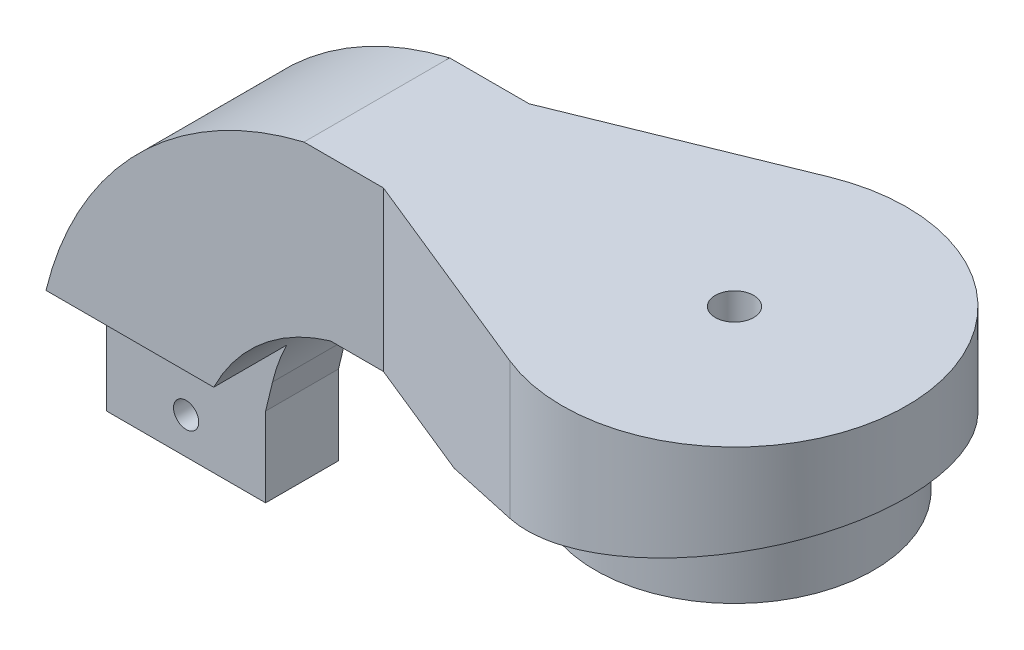
ISO-10303-21;
HEADER;
FILE_DESCRIPTION(('STEP AP214'),'2;1');
FILE_NAME('part.step','',(''),(''),'','','');
FILE_SCHEMA(('AUTOMOTIVE_DESIGN { 1 0 10303 214 1 1 1 1 }'));
ENDSEC;
DATA;
#1=APPLICATION_CONTEXT('core data for automotive mechanical design processes');
#2=APPLICATION_PROTOCOL_DEFINITION('international standard','automotive_design',2000,#1);
#3=PRODUCT_CONTEXT('',#1,'mechanical');
#4=PRODUCT('Part','Part','',(#3));
#5=PRODUCT_RELATED_PRODUCT_CATEGORY('part','',(#4));
#6=PRODUCT_DEFINITION_FORMATION('','',#4);
#7=PRODUCT_DEFINITION_CONTEXT('part definition',#1,'design');
#8=PRODUCT_DEFINITION('design','',#6,#7);
#9=PRODUCT_DEFINITION_SHAPE('','',#8);
#10=(LENGTH_UNIT() NAMED_UNIT(*) SI_UNIT(.MILLI.,.METRE.));
#11=(NAMED_UNIT(*) PLANE_ANGLE_UNIT() SI_UNIT($,.RADIAN.));
#12=(NAMED_UNIT(*) SI_UNIT($,.STERADIAN.) SOLID_ANGLE_UNIT());
#13=UNCERTAINTY_MEASURE_WITH_UNIT(LENGTH_MEASURE(1.E-05),#10,'distance_accuracy_value','');
#14=(GEOMETRIC_REPRESENTATION_CONTEXT(3) GLOBAL_UNCERTAINTY_ASSIGNED_CONTEXT((#13)) GLOBAL_UNIT_ASSIGNED_CONTEXT((#10,
#11,#12)) REPRESENTATION_CONTEXT('',''));
#15=CARTESIAN_POINT('',(0.,0.,0.));
#16=DIRECTION('',(0.,0.,1.));
#17=DIRECTION('',(1.,0.,0.));
#18=AXIS2_PLACEMENT_3D('',#15,#16,#17);
#19=CARTESIAN_POINT('',(-42.,24.,11.));
#20=DIRECTION('',(0.376404535641537,0.,-0.926455409368675));
#21=DIRECTION('',(0.,-1.,0.));
#22=AXIS2_PLACEMENT_3D('',#19,#20,#21);
#23=PLANE('',#22);
#24=DIRECTION('',(0.926455409368675,0.,0.376404535641537));
#25=VECTOR('',#24,1.);
#26=CARTESIAN_POINT('',(-42.,0.,11.));
#27=LINE('',#26,#25);
#28=CARTESIAN_POINT('',(-42.,0.,11.));
#29=VERTEX_POINT('',#28);
#30=CARTESIAN_POINT('',(-24.,0.,18.3131222215699));
#31=VERTEX_POINT('',#30);
#32=EDGE_CURVE('E441',#29,#31,#27,.T.);
#33=ORIENTED_EDGE('',*,*,#32,.T.);
#34=DIRECTION('',(0.904369439054215,0.217048665373012,0.367431346736448));
#35=VECTOR('',#34,1.);
#36=CARTESIAN_POINT('',(-36.4410054694557,-2.98584131266939,13.258533690606));
#37=LINE('',#36,#35);
#38=CARTESIAN_POINT('',(-9.78651792667998,3.41123569759681,24.0878406435855));
#39=VERTEX_POINT('',#38);
#40=EDGE_CURVE('E325',#31,#39,#37,.T.);
#41=ORIENTED_EDGE('',*,*,#40,.T.);
#42=DIRECTION('',(0.,-1.,0.));
#43=VECTOR('',#42,1.);
#44=CARTESIAN_POINT('',(-9.78651792667998,24.,24.0878406435855));
#45=LINE('',#44,#43);
#46=CARTESIAN_POINT('',(-9.78651792667998,24.,24.0878406435855));
#47=VERTEX_POINT('',#46);
#48=EDGE_CURVE('E54',#47,#39,#45,.T.);
#49=ORIENTED_EDGE('',*,*,#48,.F.);
#50=DIRECTION('',(0.926455409368675,0.,0.376404535641537));
#51=VECTOR('',#50,1.);
#52=CARTESIAN_POINT('',(-42.,24.,11.));
#53=LINE('',#52,#51);
#54=CARTESIAN_POINT('',(-42.,24.,11.));
#55=VERTEX_POINT('',#54);
#56=EDGE_CURVE('E362',#55,#47,#53,.T.);
#57=ORIENTED_EDGE('',*,*,#56,.F.);
#58=DIRECTION('',(0.,-1.,0.));
#59=VECTOR('',#58,1.);
#60=CARTESIAN_POINT('',(-42.,24.,11.));
#61=LINE('',#60,#59);
#62=EDGE_CURVE('E394',#55,#29,#61,.T.);
#63=ORIENTED_EDGE('',*,*,#62,.T.);
#64=EDGE_LOOP('',(#33,#41,#49,#57,#63));
#65=FACE_BOUND('',#64,.T.);
#66=ADVANCED_FACE('F43',(#65),#23,.F.);
#67=CARTESIAN_POINT('',(0.,24.,0.));
#68=DIRECTION('',(0.,-1.,0.));
#69=DIRECTION('',(0.,0.,-1.));
#70=AXIS2_PLACEMENT_3D('',#67,#68,#69);
#71=CYLINDRICAL_SURFACE('',#70,26.);
#72=ORIENTED_EDGE('',*,*,#48,.T.);
#73=CARTESIAN_POINT('',(-9.78651792667998,3.41123569759681,24.0878406435855));
#74=CARTESIAN_POINT('',(-6.66853530930053,4.15955152576788,25.3546288638981));
#75=CARTESIAN_POINT('',(-3.36549669401162,4.95228079343722,26.));
#76=CARTESIAN_POINT('',(0.,5.76,26.));
#77=(BOUNDED_CURVE() B_SPLINE_CURVE(3,(#73,#74,#75,#76),.UNSPECIFIED.,.F.,
.F.) B_SPLINE_CURVE_WITH_KNOTS((4,4),(1.18488398676223,1.5707963267949),
.UNSPECIFIED.) CURVE() GEOMETRIC_REPRESENTATION_ITEM() RATIONAL_B_SPLINE_CURVE((1.,
0.987627764061524,0.987627764061524,1.)) REPRESENTATION_ITEM(''));
#78=CARTESIAN_POINT('',(0.,5.76,26.));
#79=VERTEX_POINT('',#78);
#80=EDGE_CURVE('E449',#39,#79,#77,.T.);
#81=ORIENTED_EDGE('',*,*,#80,.T.);
#82=CARTESIAN_POINT('',(0.,5.76,26.));
#83=CARTESIAN_POINT('',(52.,18.24,26.));
#84=CARTESIAN_POINT('',(52.,18.24,-26.));
#85=CARTESIAN_POINT('',(0.,5.76,-26.));
#86=(BOUNDED_CURVE() B_SPLINE_CURVE(3,(#82,#83,#84,#85),.UNSPECIFIED.,.F.,
.F.) B_SPLINE_CURVE_WITH_KNOTS((4,4),(1.5707963267949,4.71238898038469),
.UNSPECIFIED.) CURVE() GEOMETRIC_REPRESENTATION_ITEM() RATIONAL_B_SPLINE_CURVE((1.,
0.333333333333334,0.333333333333334,1.)) REPRESENTATION_ITEM(''));
#87=CARTESIAN_POINT('',(0.,5.76,-26.));
#88=VERTEX_POINT('',#87);
#89=EDGE_CURVE('E47',#79,#88,#86,.T.);
#90=ORIENTED_EDGE('',*,*,#89,.T.);
#91=CARTESIAN_POINT('',(0.,5.76,-26.));
#92=CARTESIAN_POINT('',(-3.36549669401161,4.95228079343722,-26.));
#93=CARTESIAN_POINT('',(-6.66853530930052,4.15955152576788,-25.3546288638981));
#94=CARTESIAN_POINT('',(-9.78651792667997,3.41123569759681,-24.0878406435855));
#95=(BOUNDED_CURVE() B_SPLINE_CURVE(3,(#91,#92,#93,#94),.UNSPECIFIED.,.F.,
.F.) B_SPLINE_CURVE_WITH_KNOTS((4,4),(4.71238898038469,5.09830132041736),
.UNSPECIFIED.) CURVE() GEOMETRIC_REPRESENTATION_ITEM() RATIONAL_B_SPLINE_CURVE((1.,
0.987627764061524,0.987627764061524,1.)) REPRESENTATION_ITEM(''));
#96=CARTESIAN_POINT('',(-9.78651792667997,3.41123569759681,-24.0878406435855));
#97=VERTEX_POINT('',#96);
#98=EDGE_CURVE('E536',#88,#97,#95,.T.);
#99=ORIENTED_EDGE('',*,*,#98,.T.);
#100=DIRECTION('',(0.,-1.,0.));
#101=VECTOR('',#100,1.);
#102=CARTESIAN_POINT('',(-9.78651792667998,24.,-24.0878406435855));
#103=LINE('',#102,#101);
#104=CARTESIAN_POINT('',(-9.78651792667998,24.,-24.0878406435855));
#105=VERTEX_POINT('',#104);
#106=EDGE_CURVE('E356',#105,#97,#103,.T.);
#107=ORIENTED_EDGE('',*,*,#106,.F.);
#108=CARTESIAN_POINT('',(0.,24.,0.));
#109=DIRECTION('',(0.,1.,0.));
#110=DIRECTION('',(0.,0.,1.));
#111=AXIS2_PLACEMENT_3D('',#108,#109,#110);
#112=CIRCLE('',#111,26.);
#113=EDGE_CURVE('E75',#47,#105,#112,.T.);
#114=ORIENTED_EDGE('',*,*,#113,.F.);
#115=EDGE_LOOP('',(#72,#81,#90,#99,#107,#114));
#116=FACE_BOUND('',#115,.T.);
#117=ADVANCED_FACE('F492',(#116),#71,.T.);
#118=CARTESIAN_POINT('',(-42.,24.,-11.));
#119=DIRECTION('',(0.376404535641537,0.,0.926455409368675));
#120=DIRECTION('',(0.,-1.,0.));
#121=AXIS2_PLACEMENT_3D('',#118,#119,#120);
#122=PLANE('',#121);
#123=ORIENTED_EDGE('',*,*,#106,.T.);
#124=DIRECTION('',(-0.904369439054215,-0.217048665373012,0.367431346736448));
#125=VECTOR('',#124,1.);
#126=CARTESIAN_POINT('',(-36.4410054694557,-2.98584131266939,-13.258533690606));
#127=LINE('',#126,#125);
#128=CARTESIAN_POINT('',(-24.,0.,-18.3131222215699));
#129=VERTEX_POINT('',#128);
#130=EDGE_CURVE('E445',#97,#129,#127,.T.);
#131=ORIENTED_EDGE('',*,*,#130,.T.);
#132=DIRECTION('',(-0.926455409368675,0.,0.376404535641537));
#133=VECTOR('',#132,1.);
#134=CARTESIAN_POINT('',(-42.,0.,-11.));
#135=LINE('',#134,#133);
#136=CARTESIAN_POINT('',(-42.,0.,-11.));
#137=VERTEX_POINT('',#136);
#138=EDGE_CURVE('E345',#129,#137,#135,.T.);
#139=ORIENTED_EDGE('',*,*,#138,.T.);
#140=DIRECTION('',(0.,-1.,0.));
#141=VECTOR('',#140,1.);
#142=CARTESIAN_POINT('',(-42.,24.,-11.));
#143=LINE('',#142,#141);
#144=CARTESIAN_POINT('',(-42.,24.,-11.));
#145=VERTEX_POINT('',#144);
#146=EDGE_CURVE('E270',#145,#137,#143,.T.);
#147=ORIENTED_EDGE('',*,*,#146,.F.);
#148=DIRECTION('',(-0.926455409368675,0.,0.376404535641537));
#149=VECTOR('',#148,1.);
#150=CARTESIAN_POINT('',(-42.,24.,-11.));
#151=LINE('',#150,#149);
#152=EDGE_CURVE('E401',#105,#145,#151,.T.);
#153=ORIENTED_EDGE('',*,*,#152,.F.);
#154=EDGE_LOOP('',(#123,#131,#139,#147,#153));
#155=FACE_BOUND('',#154,.T.);
#156=ADVANCED_FACE('F497',(#155),#122,.F.);
#157=CARTESIAN_POINT('',(0.,24.,0.));
#158=DIRECTION('',(0.,1.,0.));
#159=DIRECTION('',(1.,0.,0.));
#160=AXIS2_PLACEMENT_3D('',#157,#158,#159);
#161=PLANE('',#160);
#162=CARTESIAN_POINT('',(0.,24.,0.));
#163=DIRECTION('',(0.,1.,0.));
#164=DIRECTION('',(0.,0.,1.));
#165=AXIS2_PLACEMENT_3D('',#162,#163,#164);
#166=CIRCLE('',#165,2.89999999999999);
#167=CARTESIAN_POINT('',(0.,24.,2.89999999999999));
#168=VERTEX_POINT('',#167);
#169=EDGE_CURVE('E670',#168,#168,#166,.T.);
#170=ORIENTED_EDGE('',*,*,#169,.F.);
#171=EDGE_LOOP('',(#170));
#172=FACE_BOUND('',#171,.T.);
#173=ORIENTED_EDGE('',*,*,#152,.T.);
#174=DIRECTION('',(-1.,0.,0.));
#175=VECTOR('',#174,1.);
#176=CARTESIAN_POINT('',(0.,24.,-11.));
#177=LINE('',#176,#175);
#178=CARTESIAN_POINT('',(-54.,24.,-11.));
#179=VERTEX_POINT('',#178);
#180=EDGE_CURVE('E166',#145,#179,#177,.T.);
#181=ORIENTED_EDGE('',*,*,#180,.T.);
#182=DIRECTION('',(0.,0.,-1.));
#183=VECTOR('',#182,1.);
#184=CARTESIAN_POINT('',(-54.,24.,11.));
#185=LINE('',#184,#183);
#186=CARTESIAN_POINT('',(-54.,24.,11.));
#187=VERTEX_POINT('',#186);
#188=EDGE_CURVE('E344',#187,#179,#185,.T.);
#189=ORIENTED_EDGE('',*,*,#188,.F.);
#190=DIRECTION('',(-1.,0.,0.));
#191=VECTOR('',#190,1.);
#192=CARTESIAN_POINT('',(0.,24.,11.));
#193=LINE('',#192,#191);
#194=EDGE_CURVE('E337',#55,#187,#193,.T.);
#195=ORIENTED_EDGE('',*,*,#194,.F.);
#196=ORIENTED_EDGE('',*,*,#56,.T.);
#197=ORIENTED_EDGE('',*,*,#113,.T.);
#198=EDGE_LOOP('',(#173,#181,#189,#195,#196,#197));
#199=FACE_BOUND('',#198,.T.);
#200=ADVANCED_FACE('F409',(#172,#199),#161,.T.);
#201=CARTESIAN_POINT('',(0.,0.,0.));
#202=DIRECTION('',(0.,1.,0.));
#203=DIRECTION('',(1.,0.,0.));
#204=AXIS2_PLACEMENT_3D('',#201,#202,#203);
#205=PLANE('',#204);
#206=ORIENTED_EDGE('',*,*,#138,.F.);
#207=DIRECTION('',(0.,0.,1.));
#208=VECTOR('',#207,1.);
#209=CARTESIAN_POINT('',(-24.,0.,0.));
#210=LINE('',#209,#208);
#211=EDGE_CURVE('E339',#129,#31,#210,.T.);
#212=ORIENTED_EDGE('',*,*,#211,.T.);
#213=ORIENTED_EDGE('',*,*,#32,.F.);
#214=DIRECTION('',(-1.,0.,0.));
#215=VECTOR('',#214,1.);
#216=CARTESIAN_POINT('',(0.,0.,11.));
#217=LINE('',#216,#215);
#218=CARTESIAN_POINT('',(-50.,0.,11.));
#219=VERTEX_POINT('',#218);
#220=EDGE_CURVE('E336',#29,#219,#217,.T.);
#221=ORIENTED_EDGE('',*,*,#220,.T.);
#222=DIRECTION('',(0.,0.,-1.));
#223=VECTOR('',#222,1.);
#224=CARTESIAN_POINT('',(-50.,0.,11.));
#225=LINE('',#224,#223);
#226=CARTESIAN_POINT('',(-50.,0.,-11.));
#227=VERTEX_POINT('',#226);
#228=EDGE_CURVE('E279',#219,#227,#225,.T.);
#229=ORIENTED_EDGE('',*,*,#228,.T.);
#230=DIRECTION('',(-1.,0.,0.));
#231=VECTOR('',#230,1.);
#232=CARTESIAN_POINT('',(0.,0.,-11.));
#233=LINE('',#232,#231);
#234=EDGE_CURVE('E273',#137,#227,#233,.T.);
#235=ORIENTED_EDGE('',*,*,#234,.F.);
#236=EDGE_LOOP('',(#206,#212,#213,#221,#229,#235));
#237=FACE_BOUND('',#236,.T.);
#238=ADVANCED_FACE('F45',(#237),#205,.F.);
#239=CARTESIAN_POINT('',(-24.,0.,-29.5));
#240=DIRECTION('',(-0.233372952475324,0.972387301980517,0.));
#241=DIRECTION('',(0.,0.,-1.));
#242=AXIS2_PLACEMENT_3D('',#239,#240,#241);
#243=PLANE('',#242);
#244=CARTESIAN_POINT('',(0.,5.76,0.));
#245=DIRECTION('',(0.233372952475324,-0.972387301980517,0.));
#246=DIRECTION('',(-0.972387301980518,-0.233372952475324,0.));
#247=AXIS2_PLACEMENT_3D('',#244,#245,#246);
#248=ELLIPSE('',#247,21.5963330220665,21.);
#249=CARTESIAN_POINT('',(-21.,0.719999999999996,0.));
#250=VERTEX_POINT('',#249);
#251=EDGE_CURVE('E12',#250,#250,#248,.F.);
#252=ORIENTED_EDGE('',*,*,#251,.T.);
#253=EDGE_LOOP('',(#252));
#254=FACE_BOUND('',#253,.T.);
#255=ORIENTED_EDGE('',*,*,#211,.F.);
#256=ORIENTED_EDGE('',*,*,#130,.F.);
#257=ORIENTED_EDGE('',*,*,#98,.F.);
#258=ORIENTED_EDGE('',*,*,#89,.F.);
#259=ORIENTED_EDGE('',*,*,#80,.F.);
#260=ORIENTED_EDGE('',*,*,#40,.F.);
#261=EDGE_LOOP('',(#255,#256,#257,#258,#259,#260));
#262=FACE_BOUND('',#261,.T.);
#263=ADVANCED_FACE('F701',(#254,#262),#243,.F.);
#264=CARTESIAN_POINT('',(-41.7095894033961,-27.2551559973421,11.));
#265=DIRECTION('',(0.,0.,-1.));
#266=DIRECTION('',(-1.,0.,0.));
#267=AXIS2_PLACEMENT_3D('',#264,#265,#266);
#268=CYLINDRICAL_SURFACE('',#267,52.7081133123259);
#269=CARTESIAN_POINT('',(-41.7095894033961,-27.2551559973421,-11.));
#270=DIRECTION('',(0.,0.,-1.));
#271=DIRECTION('',(1.,0.,0.));
#272=AXIS2_PLACEMENT_3D('',#269,#270,#271);
#273=CIRCLE('',#272,52.7081133123259);
#274=CARTESIAN_POINT('',(-92.9418253522618,-14.8695511019506,-11.));
#275=VERTEX_POINT('',#274);
#276=EDGE_CURVE('E173',#275,#179,#273,.T.);
#277=ORIENTED_EDGE('',*,*,#276,.F.);
#278=DIRECTION('',(0.,0.,-1.));
#279=VECTOR('',#278,1.);
#280=CARTESIAN_POINT('',(-92.9418253522618,-14.8695511019506,11.));
#281=LINE('',#280,#279);
#282=CARTESIAN_POINT('',(-92.9418253522618,-14.8695511019506,0.));
#283=VERTEX_POINT('',#282);
#284=EDGE_CURVE('E395',#283,#275,#281,.T.);
#285=ORIENTED_EDGE('',*,*,#284,.F.);
#286=DIRECTION('',(0.,0.,-1.));
#287=VECTOR('',#286,1.);
#288=CARTESIAN_POINT('',(-92.9418253522618,-14.8695511019506,11.));
#289=LINE('',#288,#287);
#290=CARTESIAN_POINT('',(-92.9418253522618,-14.8695511019506,11.));
#291=VERTEX_POINT('',#290);
#292=EDGE_CURVE('E284',#291,#283,#289,.T.);
#293=ORIENTED_EDGE('',*,*,#292,.F.);
#294=CARTESIAN_POINT('',(-41.7095894033961,-27.2551559973421,11.));
#295=DIRECTION('',(0.,0.,-1.));
#296=DIRECTION('',(1.,0.,0.));
#297=AXIS2_PLACEMENT_3D('',#294,#295,#296);
#298=CIRCLE('',#297,52.7081133123259);
#299=EDGE_CURVE('E132',#291,#187,#298,.T.);
#300=ORIENTED_EDGE('',*,*,#299,.T.);
#301=ORIENTED_EDGE('',*,*,#188,.T.);
#302=EDGE_LOOP('',(#277,#285,#293,#300,#301));
#303=FACE_BOUND('',#302,.T.);
#304=ADVANCED_FACE('F607',(#303),#268,.T.);
#305=CARTESIAN_POINT('',(-84.4134977836503,20.4073121545938,11.));
#306=DIRECTION('',(0.971999047761113,-0.234984789191746,0.));
#307=DIRECTION('',(0.,0.,1.));
#308=AXIS2_PLACEMENT_3D('',#305,#306,#307);
#309=PLANE('',#308);
#310=DIRECTION('',(0.,0.,-1.));
#311=VECTOR('',#310,1.);
#312=CARTESIAN_POINT('',(-94.78651792668,-22.5,11.));
#313=LINE('',#312,#311);
#314=CARTESIAN_POINT('',(-94.78651792668,-22.5,0.));
#315=VERTEX_POINT('',#314);
#316=CARTESIAN_POINT('',(-94.78651792668,-22.5,-11.));
#317=VERTEX_POINT('',#316);
#318=EDGE_CURVE('E399',#315,#317,#313,.T.);
#319=ORIENTED_EDGE('',*,*,#318,.F.);
#320=DIRECTION('',(-0.234984789191746,-0.971999047761113,0.));
#321=VECTOR('',#320,1.);
#322=CARTESIAN_POINT('',(-86.374058126423,12.2975838917223,0.));
#323=LINE('',#322,#321);
#324=EDGE_CURVE('E266',#283,#315,#323,.T.);
#325=ORIENTED_EDGE('',*,*,#324,.F.);
#326=ORIENTED_EDGE('',*,*,#284,.T.);
#327=DIRECTION('',(-0.234984789191746,-0.971999047761113,0.));
#328=VECTOR('',#327,1.);
#329=CARTESIAN_POINT('',(-84.4134977836503,20.4073121545938,-11.));
#330=LINE('',#329,#328);
#331=EDGE_CURVE('E323',#275,#317,#330,.T.);
#332=ORIENTED_EDGE('',*,*,#331,.T.);
#333=EDGE_LOOP('',(#319,#325,#326,#332));
#334=FACE_BOUND('',#333,.T.);
#335=ADVANCED_FACE('F609',(#334),#309,.F.);
#336=CARTESIAN_POINT('',(-94.78651792668,0.,11.));
#337=DIRECTION('',(1.,0.,0.));
#338=DIRECTION('',(0.,1.,0.));
#339=AXIS2_PLACEMENT_3D('',#336,#337,#338);
#340=PLANE('',#339);
#341=DIRECTION('',(0.,-1.,0.));
#342=VECTOR('',#341,1.);
#343=CARTESIAN_POINT('',(-94.78651792668,-14.8695511019506,0.));
#344=LINE('',#343,#342);
#345=CARTESIAN_POINT('',(-94.78651792668,-37.0753078944647,0.));
#346=VERTEX_POINT('',#345);
#347=EDGE_CURVE('E280',#315,#346,#344,.T.);
#348=ORIENTED_EDGE('',*,*,#347,.F.);
#349=ORIENTED_EDGE('',*,*,#318,.T.);
#350=DIRECTION('',(0.,-1.,0.));
#351=VECTOR('',#350,1.);
#352=CARTESIAN_POINT('',(-94.78651792668,0.,-11.));
#353=LINE('',#352,#351);
#354=CARTESIAN_POINT('',(-94.78651792668,-37.0753078944647,-11.));
#355=VERTEX_POINT('',#354);
#356=EDGE_CURVE('E145',#317,#355,#353,.T.);
#357=ORIENTED_EDGE('',*,*,#356,.T.);
#358=DIRECTION('',(0.,0.,1.));
#359=VECTOR('',#358,1.);
#360=CARTESIAN_POINT('',(-94.78651792668,-37.0753078944647,0.));
#361=LINE('',#360,#359);
#362=EDGE_CURVE('E259',#355,#346,#361,.T.);
#363=ORIENTED_EDGE('',*,*,#362,.T.);
#364=EDGE_LOOP('',(#348,#349,#357,#363));
#365=FACE_BOUND('',#364,.T.);
#366=ADVANCED_FACE('F471',(#365),#340,.F.);
#367=CARTESIAN_POINT('',(-61.1505130339718,14.7833893946227,11.));
#368=DIRECTION('',(0.971999047761113,-0.234984789191746,0.));
#369=DIRECTION('',(0.,0.,1.));
#370=AXIS2_PLACEMENT_3D('',#367,#368,#369);
#371=PLANE('',#370);
#372=DIRECTION('',(-0.234984789191746,-0.971999047761113,0.));
#373=VECTOR('',#372,1.);
#374=CARTESIAN_POINT('',(-63.1110733767444,6.67366113175113,0.));
#375=LINE('',#374,#373);
#376=CARTESIAN_POINT('',(-69.7388628081069,-20.7417517475427,0.));
#377=VERTEX_POINT('',#376);
#378=CARTESIAN_POINT('',(-70.78651792668,-25.0753078944646,0.));
#379=VERTEX_POINT('',#378);
#380=EDGE_CURVE('E285',#377,#379,#375,.T.);
#381=ORIENTED_EDGE('',*,*,#380,.T.);
#382=DIRECTION('',(0.,0.,-1.));
#383=VECTOR('',#382,1.);
#384=CARTESIAN_POINT('',(-70.78651792668,-25.0753078944647,11.));
#385=LINE('',#384,#383);
#386=CARTESIAN_POINT('',(-70.78651792668,-25.0753078944646,-11.));
#387=VERTEX_POINT('',#386);
#388=EDGE_CURVE('E278',#379,#387,#385,.T.);
#389=ORIENTED_EDGE('',*,*,#388,.T.);
#390=DIRECTION('',(-0.234984789191746,-0.971999047761113,0.));
#391=VECTOR('',#390,1.);
#392=CARTESIAN_POINT('',(-61.1505130339718,14.7833893946227,-11.));
#393=LINE('',#392,#391);
#394=CARTESIAN_POINT('',(-69.7388628081069,-20.7417517475427,-11.));
#395=VERTEX_POINT('',#394);
#396=EDGE_CURVE('E263',#395,#387,#393,.T.);
#397=ORIENTED_EDGE('',*,*,#396,.F.);
#398=DIRECTION('',(0.,0.,-1.));
#399=VECTOR('',#398,1.);
#400=CARTESIAN_POINT('',(-69.7388628081069,-20.7417517475427,11.));
#401=LINE('',#400,#399);
#402=EDGE_CURVE('E274',#377,#395,#401,.T.);
#403=ORIENTED_EDGE('',*,*,#402,.F.);
#404=EDGE_LOOP('',(#381,#389,#397,#403));
#405=FACE_BOUND('',#404,.T.);
#406=ADVANCED_FACE('F696',(#405),#371,.T.);
#407=CARTESIAN_POINT('',(-41.8993681465749,-27.4720647034177,11.));
#408=DIRECTION('',(0.,0.,-1.));
#409=DIRECTION('',(-1.,0.,0.));
#410=AXIS2_PLACEMENT_3D('',#407,#408,#409);
#411=CYLINDRICAL_SURFACE('',#410,28.6414834722905);
#412=CARTESIAN_POINT('',(-41.8993681465749,-27.4720647034177,11.));
#413=DIRECTION('',(0.,0.,-1.));
#414=DIRECTION('',(1.,0.,0.));
#415=AXIS2_PLACEMENT_3D('',#412,#413,#414);
#416=CIRCLE('',#415,28.6414834722905);
#417=CARTESIAN_POINT('',(-67.6192286908766,-14.8695511019506,11.));
#418=VERTEX_POINT('',#417);
#419=EDGE_CURVE('E331',#418,#219,#416,.T.);
#420=ORIENTED_EDGE('',*,*,#419,.F.);
#421=DIRECTION('',(0.,0.,1.));
#422=VECTOR('',#421,1.);
#423=CARTESIAN_POINT('',(-67.6192286908766,-14.8695511019506,11.));
#424=LINE('',#423,#422);
#425=CARTESIAN_POINT('',(-67.6192286908766,-14.8695511019506,0.));
#426=VERTEX_POINT('',#425);
#427=EDGE_CURVE('E390',#426,#418,#424,.T.);
#428=ORIENTED_EDGE('',*,*,#427,.F.);
#429=CARTESIAN_POINT('',(-41.8993681465749,-27.4720647034177,0.));
#430=DIRECTION('',(0.,0.,-1.));
#431=DIRECTION('',(-1.,0.,0.));
#432=AXIS2_PLACEMENT_3D('',#429,#430,#431);
#433=CIRCLE('',#432,28.6414834722905);
#434=EDGE_CURVE('E386',#377,#426,#433,.T.);
#435=ORIENTED_EDGE('',*,*,#434,.F.);
#436=ORIENTED_EDGE('',*,*,#402,.T.);
#437=CARTESIAN_POINT('',(-41.8993681465749,-27.4720647034177,-11.));
#438=DIRECTION('',(0.,0.,-1.));
#439=DIRECTION('',(1.,0.,0.));
#440=AXIS2_PLACEMENT_3D('',#437,#438,#439);
#441=CIRCLE('',#440,28.6414834722905);
#442=EDGE_CURVE('E389',#395,#227,#441,.T.);
#443=ORIENTED_EDGE('',*,*,#442,.T.);
#444=ORIENTED_EDGE('',*,*,#228,.F.);
#445=EDGE_LOOP('',(#420,#428,#435,#436,#443,#444));
#446=FACE_BOUND('',#445,.T.);
#447=ADVANCED_FACE('F599',(#446),#411,.F.);
#448=CARTESIAN_POINT('',(0.,0.,11.));
#449=DIRECTION('',(0.,0.,1.));
#450=DIRECTION('',(0.,-1.,0.));
#451=AXIS2_PLACEMENT_3D('',#448,#449,#450);
#452=PLANE('',#451);
#453=DIRECTION('',(1.,0.,0.));
#454=VECTOR('',#453,1.);
#455=CARTESIAN_POINT('',(26.001,-14.8695511019506,11.));
#456=LINE('',#455,#454);
#457=EDGE_CURVE('E368',#291,#418,#456,.T.);
#458=ORIENTED_EDGE('',*,*,#457,.T.);
#459=ORIENTED_EDGE('',*,*,#419,.T.);
#460=ORIENTED_EDGE('',*,*,#220,.F.);
#461=ORIENTED_EDGE('',*,*,#62,.F.);
#462=ORIENTED_EDGE('',*,*,#194,.T.);
#463=ORIENTED_EDGE('',*,*,#299,.F.);
#464=EDGE_LOOP('',(#458,#459,#460,#461,#462,#463));
#465=FACE_BOUND('',#464,.T.);
#466=ADVANCED_FACE('F591',(#465),#452,.T.);
#467=CARTESIAN_POINT('',(0.,0.,-11.));
#468=DIRECTION('',(0.,0.,1.));
#469=DIRECTION('',(0.,-1.,0.));
#470=AXIS2_PLACEMENT_3D('',#467,#468,#469);
#471=PLANE('',#470);
#472=CARTESIAN_POINT('',(-82.78651792668,-31.5753078944647,-11.));
#473=DIRECTION('',(0.,0.,1.));
#474=DIRECTION('',(1.,0.,0.));
#475=AXIS2_PLACEMENT_3D('',#472,#473,#474);
#476=CIRCLE('',#475,1.89999999999999);
#477=CARTESIAN_POINT('',(-80.88651792668,-31.5753078944647,-11.));
#478=VERTEX_POINT('',#477);
#479=EDGE_CURVE('E667',#478,#478,#476,.T.);
#480=ORIENTED_EDGE('',*,*,#479,.T.);
#481=EDGE_LOOP('',(#480));
#482=FACE_BOUND('',#481,.T.);
#483=CARTESIAN_POINT('',(-81.9601774293469,-20.3695511019507,-11.));
#484=DIRECTION('',(0.,0.,1.));
#485=DIRECTION('',(1.,0.,0.));
#486=AXIS2_PLACEMENT_3D('',#483,#484,#485);
#487=CIRCLE('',#486,1.89999999999999);
#488=CARTESIAN_POINT('',(-80.0601774293469,-20.3695511019507,-11.));
#489=VERTEX_POINT('',#488);
#490=EDGE_CURVE('E661',#489,#489,#487,.T.);
#491=ORIENTED_EDGE('',*,*,#490,.T.);
#492=EDGE_LOOP('',(#491));
#493=FACE_BOUND('',#492,.T.);
#494=ORIENTED_EDGE('',*,*,#356,.F.);
#495=ORIENTED_EDGE('',*,*,#331,.F.);
#496=ORIENTED_EDGE('',*,*,#276,.T.);
#497=ORIENTED_EDGE('',*,*,#180,.F.);
#498=ORIENTED_EDGE('',*,*,#146,.T.);
#499=ORIENTED_EDGE('',*,*,#234,.T.);
#500=ORIENTED_EDGE('',*,*,#442,.F.);
#501=ORIENTED_EDGE('',*,*,#396,.T.);
#502=DIRECTION('',(0.,1.,0.));
#503=VECTOR('',#502,1.);
#504=CARTESIAN_POINT('',(-70.78651792668,-37.0753078944647,-11.));
#505=LINE('',#504,#503);
#506=CARTESIAN_POINT('',(-70.78651792668,-37.0753078944647,-11.));
#507=VERTEX_POINT('',#506);
#508=EDGE_CURVE('E203',#507,#387,#505,.T.);
#509=ORIENTED_EDGE('',*,*,#508,.F.);
#510=DIRECTION('',(-1.,0.,0.));
#511=VECTOR('',#510,1.);
#512=CARTESIAN_POINT('',(-94.78651792668,-37.0753078944647,-11.));
#513=LINE('',#512,#511);
#514=EDGE_CURVE('E256',#507,#355,#513,.T.);
#515=ORIENTED_EDGE('',*,*,#514,.T.);
#516=EDGE_LOOP('',(#494,#495,#496,#497,#498,#499,#500,#501,#509,#515));
#517=FACE_BOUND('',#516,.T.);
#518=ADVANCED_FACE('F261',(#482,#493,#517),#471,.F.);
#519=CARTESIAN_POINT('',(26.001,-14.8695511019506,34.5150950819672));
#520=DIRECTION('',(0.,1.,0.));
#521=DIRECTION('',(0.,0.,1.));
#522=AXIS2_PLACEMENT_3D('',#519,#520,#521);
#523=PLANE('',#522);
#524=ORIENTED_EDGE('',*,*,#292,.T.);
#525=DIRECTION('',(-1.,0.,0.));
#526=VECTOR('',#525,1.);
#527=CARTESIAN_POINT('',(26.001,-14.8695511019506,0.));
#528=LINE('',#527,#526);
#529=EDGE_CURVE('E195',#426,#283,#528,.T.);
#530=ORIENTED_EDGE('',*,*,#529,.F.);
#531=ORIENTED_EDGE('',*,*,#427,.T.);
#532=ORIENTED_EDGE('',*,*,#457,.F.);
#533=EDGE_LOOP('',(#524,#530,#531,#532));
#534=FACE_BOUND('',#533,.T.);
#535=ADVANCED_FACE('F596',(#534),#523,.F.);
#536=CARTESIAN_POINT('',(26.001,-14.8695511019506,0.));
#537=DIRECTION('',(0.,0.,-1.));
#538=DIRECTION('',(1.,0.,0.));
#539=AXIS2_PLACEMENT_3D('',#536,#537,#538);
#540=PLANE('',#539);
#541=CARTESIAN_POINT('',(-82.78651792668,-31.5753078944647,0.));
#542=DIRECTION('',(0.,0.,1.));
#543=DIRECTION('',(1.,0.,0.));
#544=AXIS2_PLACEMENT_3D('',#541,#542,#543);
#545=CIRCLE('',#544,1.89999999999999);
#546=CARTESIAN_POINT('',(-80.88651792668,-31.5753078944647,0.));
#547=VERTEX_POINT('',#546);
#548=EDGE_CURVE('E664',#547,#547,#545,.T.);
#549=ORIENTED_EDGE('',*,*,#548,.F.);
#550=EDGE_LOOP('',(#549));
#551=FACE_BOUND('',#550,.T.);
#552=CARTESIAN_POINT('',(-81.9601774293469,-20.3695511019507,0.));
#553=DIRECTION('',(0.,0.,1.));
#554=DIRECTION('',(1.,0.,0.));
#555=AXIS2_PLACEMENT_3D('',#552,#553,#554);
#556=CIRCLE('',#555,1.89999999999999);
#557=CARTESIAN_POINT('',(-80.0601774293469,-20.3695511019507,0.));
#558=VERTEX_POINT('',#557);
#559=EDGE_CURVE('E645',#558,#558,#556,.T.);
#560=ORIENTED_EDGE('',*,*,#559,.F.);
#561=EDGE_LOOP('',(#560));
#562=FACE_BOUND('',#561,.T.);
#563=ORIENTED_EDGE('',*,*,#380,.F.);
#564=ORIENTED_EDGE('',*,*,#434,.T.);
#565=ORIENTED_EDGE('',*,*,#529,.T.);
#566=ORIENTED_EDGE('',*,*,#324,.T.);
#567=ORIENTED_EDGE('',*,*,#347,.T.);
#568=DIRECTION('',(1.,0.,0.));
#569=VECTOR('',#568,1.);
#570=CARTESIAN_POINT('',(-70.78651792668,-37.0753078944647,0.));
#571=LINE('',#570,#569);
#572=CARTESIAN_POINT('',(-70.78651792668,-37.0753078944647,0.));
#573=VERTEX_POINT('',#572);
#574=EDGE_CURVE('E212',#346,#573,#571,.T.);
#575=ORIENTED_EDGE('',*,*,#574,.T.);
#576=DIRECTION('',(0.,1.,0.));
#577=VECTOR('',#576,1.);
#578=CARTESIAN_POINT('',(-70.78651792668,-37.0753078944647,0.));
#579=LINE('',#578,#577);
#580=EDGE_CURVE('E223',#573,#379,#579,.T.);
#581=ORIENTED_EDGE('',*,*,#580,.T.);
#582=EDGE_LOOP('',(#563,#564,#565,#566,#567,#575,#581));
#583=FACE_BOUND('',#582,.T.);
#584=ADVANCED_FACE('F610',(#551,#562,#583),#540,.F.);
#585=CARTESIAN_POINT('',(-70.78651792668,-37.0753078944647,-11.));
#586=DIRECTION('',(-1.,0.,0.));
#587=DIRECTION('',(0.,0.,-1.));
#588=AXIS2_PLACEMENT_3D('',#585,#586,#587);
#589=PLANE('',#588);
#590=ORIENTED_EDGE('',*,*,#388,.F.);
#591=ORIENTED_EDGE('',*,*,#580,.F.);
#592=DIRECTION('',(0.,0.,-1.));
#593=VECTOR('',#592,1.);
#594=CARTESIAN_POINT('',(-70.78651792668,-37.0753078944647,-11.));
#595=LINE('',#594,#593);
#596=EDGE_CURVE('E253',#573,#507,#595,.T.);
#597=ORIENTED_EDGE('',*,*,#596,.T.);
#598=ORIENTED_EDGE('',*,*,#508,.T.);
#599=EDGE_LOOP('',(#590,#591,#597,#598));
#600=FACE_BOUND('',#599,.T.);
#601=ADVANCED_FACE('F255',(#600),#589,.F.);
#602=CARTESIAN_POINT('',(0.,-37.0753078944647,0.));
#603=DIRECTION('',(0.,1.,0.));
#604=DIRECTION('',(0.,0.,-1.));
#605=AXIS2_PLACEMENT_3D('',#602,#603,#604);
#606=PLANE('',#605);
#607=ORIENTED_EDGE('',*,*,#574,.F.);
#608=ORIENTED_EDGE('',*,*,#362,.F.);
#609=ORIENTED_EDGE('',*,*,#514,.F.);
#610=ORIENTED_EDGE('',*,*,#596,.F.);
#611=EDGE_LOOP('',(#607,#608,#609,#610));
#612=FACE_BOUND('',#611,.T.);
#613=ADVANCED_FACE('F258',(#612),#606,.F.);
#614=CARTESIAN_POINT('',(0.,24.002,0.));
#615=DIRECTION('',(0.,-1.,0.));
#616=DIRECTION('',(0.,0.,1.));
#617=AXIS2_PLACEMENT_3D('',#614,#615,#616);
#618=CYLINDRICAL_SURFACE('',#617,21.);
#619=CARTESIAN_POINT('',(0.,0.,0.));
#620=DIRECTION('',(0.,1.,0.));
#621=DIRECTION('',(0.,0.,-1.));
#622=AXIS2_PLACEMENT_3D('',#619,#620,#621);
#623=CIRCLE('',#622,21.);
#624=CARTESIAN_POINT('',(0.,0.,-21.));
#625=VERTEX_POINT('',#624);
#626=EDGE_CURVE('E611',#625,#625,#623,.T.);
#627=ORIENTED_EDGE('',*,*,#626,.T.);
#628=EDGE_LOOP('',(#627));
#629=FACE_BOUND('',#628,.T.);
#630=ORIENTED_EDGE('',*,*,#251,.F.);
#631=EDGE_LOOP('',(#630));
#632=FACE_BOUND('',#631,.T.);
#633=ADVANCED_FACE('F735',(#629,#632),#618,.T.);
#634=CARTESIAN_POINT('',(0.,0.,0.));
#635=DIRECTION('',(0.,1.,0.));
#636=DIRECTION('',(0.,0.,-1.));
#637=AXIS2_PLACEMENT_3D('',#634,#635,#636);
#638=PLANE('',#637);
#639=DIRECTION('',(1.,0.,0.));
#640=VECTOR('',#639,1.);
#641=CARTESIAN_POINT('',(-2.82901631902917,0.,4.9));
#642=LINE('',#641,#640);
#643=CARTESIAN_POINT('',(-2.82901631902917,0.,4.9));
#644=VERTEX_POINT('',#643);
#645=CARTESIAN_POINT('',(2.82901631902916,0.,4.9));
#646=VERTEX_POINT('',#645);
#647=EDGE_CURVE('E640',#644,#646,#642,.T.);
#648=ORIENTED_EDGE('',*,*,#647,.T.);
#649=DIRECTION('',(0.5,0.,-0.866025403784439));
#650=VECTOR('',#649,1.);
#651=CARTESIAN_POINT('',(2.82901631902916,0.,4.9));
#652=LINE('',#651,#650);
#653=CARTESIAN_POINT('',(5.65803263805833,0.,0.));
#654=VERTEX_POINT('',#653);
#655=EDGE_CURVE('E637',#646,#654,#652,.T.);
#656=ORIENTED_EDGE('',*,*,#655,.T.);
#657=DIRECTION('',(-0.5,0.,-0.866025403784439));
#658=VECTOR('',#657,1.);
#659=CARTESIAN_POINT('',(5.65803263805833,0.,0.));
#660=LINE('',#659,#658);
#661=CARTESIAN_POINT('',(2.82901631902916,0.,-4.9));
#662=VERTEX_POINT('',#661);
#663=EDGE_CURVE('E634',#654,#662,#660,.T.);
#664=ORIENTED_EDGE('',*,*,#663,.T.);
#665=DIRECTION('',(-1.,0.,0.));
#666=VECTOR('',#665,1.);
#667=CARTESIAN_POINT('',(2.82901631902916,0.,-4.9));
#668=LINE('',#667,#666);
#669=CARTESIAN_POINT('',(-2.82901631902916,0.,-4.9));
#670=VERTEX_POINT('',#669);
#671=EDGE_CURVE('E631',#662,#670,#668,.T.);
#672=ORIENTED_EDGE('',*,*,#671,.T.);
#673=DIRECTION('',(-0.5,0.,0.866025403784439));
#674=VECTOR('',#673,1.);
#675=CARTESIAN_POINT('',(-2.82901631902916,0.,-4.9));
#676=LINE('',#675,#674);
#677=CARTESIAN_POINT('',(-5.65803263805833,0.,0.));
#678=VERTEX_POINT('',#677);
#679=EDGE_CURVE('E627',#670,#678,#676,.T.);
#680=ORIENTED_EDGE('',*,*,#679,.T.);
#681=DIRECTION('',(0.499999999999999,0.,0.866025403784439));
#682=VECTOR('',#681,1.);
#683=CARTESIAN_POINT('',(-5.65803263805833,0.,0.));
#684=LINE('',#683,#682);
#685=EDGE_CURVE('E643',#678,#644,#684,.T.);
#686=ORIENTED_EDGE('',*,*,#685,.T.);
#687=EDGE_LOOP('',(#648,#656,#664,#672,#680,#686));
#688=FACE_BOUND('',#687,.T.);
#689=ORIENTED_EDGE('',*,*,#626,.F.);
#690=EDGE_LOOP('',(#689));
#691=FACE_BOUND('',#690,.T.);
#692=ADVANCED_FACE('F738',(#688,#691),#638,.F.);
#693=CARTESIAN_POINT('',(-5.65803263805833,4.,0.));
#694=DIRECTION('',(-0.866025403784439,0.,0.499999999999999));
#695=DIRECTION('',(-0.499999999999999,0.,-0.866025403784439));
#696=AXIS2_PLACEMENT_3D('',#693,#694,#695);
#697=PLANE('',#696);
#698=ORIENTED_EDGE('',*,*,#685,.F.);
#699=DIRECTION('',(0.,-1.,0.));
#700=VECTOR('',#699,1.);
#701=CARTESIAN_POINT('',(-5.65803263805833,4.,0.));
#702=LINE('',#701,#700);
#703=CARTESIAN_POINT('',(-5.65803263805833,4.,0.));
#704=VERTEX_POINT('',#703);
#705=EDGE_CURVE('E614',#704,#678,#702,.T.);
#706=ORIENTED_EDGE('',*,*,#705,.F.);
#707=DIRECTION('',(0.499999999999999,0.,0.866025403784439));
#708=VECTOR('',#707,1.);
#709=CARTESIAN_POINT('',(-5.65803263805833,4.,0.));
#710=LINE('',#709,#708);
#711=CARTESIAN_POINT('',(-2.82901631902917,4.,4.9));
#712=VERTEX_POINT('',#711);
#713=EDGE_CURVE('E630',#704,#712,#710,.T.);
#714=ORIENTED_EDGE('',*,*,#713,.T.);
#715=DIRECTION('',(0.,-1.,0.));
#716=VECTOR('',#715,1.);
#717=CARTESIAN_POINT('',(-2.82901631902917,4.,4.9));
#718=LINE('',#717,#716);
#719=EDGE_CURVE('E62',#712,#644,#718,.T.);
#720=ORIENTED_EDGE('',*,*,#719,.T.);
#721=EDGE_LOOP('',(#698,#706,#714,#720));
#722=FACE_BOUND('',#721,.T.);
#723=ADVANCED_FACE('F742',(#722),#697,.F.);
#724=CARTESIAN_POINT('',(-2.82901631902916,4.,-4.9));
#725=DIRECTION('',(-0.866025403784439,0.,-0.5));
#726=DIRECTION('',(0.5,0.,-0.866025403784439));
#727=AXIS2_PLACEMENT_3D('',#724,#725,#726);
#728=PLANE('',#727);
#729=ORIENTED_EDGE('',*,*,#679,.F.);
#730=DIRECTION('',(0.,-1.,0.));
#731=VECTOR('',#730,1.);
#732=CARTESIAN_POINT('',(-2.82901631902916,4.,-4.9));
#733=LINE('',#732,#731);
#734=CARTESIAN_POINT('',(-2.82901631902916,4.,-4.9));
#735=VERTEX_POINT('',#734);
#736=EDGE_CURVE('E624',#735,#670,#733,.T.);
#737=ORIENTED_EDGE('',*,*,#736,.F.);
#738=DIRECTION('',(-0.5,0.,0.866025403784439));
#739=VECTOR('',#738,1.);
#740=CARTESIAN_POINT('',(-2.82901631902916,4.,-4.9));
#741=LINE('',#740,#739);
#742=EDGE_CURVE('E232',#735,#704,#741,.T.);
#743=ORIENTED_EDGE('',*,*,#742,.T.);
#744=ORIENTED_EDGE('',*,*,#705,.T.);
#745=EDGE_LOOP('',(#729,#737,#743,#744));
#746=FACE_BOUND('',#745,.T.);
#747=ADVANCED_FACE('F746',(#746),#728,.F.);
#748=CARTESIAN_POINT('',(2.82901631902916,4.,-4.9));
#749=DIRECTION('',(0.,0.,-1.));
#750=DIRECTION('',(1.,0.,0.));
#751=AXIS2_PLACEMENT_3D('',#748,#749,#750);
#752=PLANE('',#751);
#753=ORIENTED_EDGE('',*,*,#671,.F.);
#754=DIRECTION('',(0.,-1.,0.));
#755=VECTOR('',#754,1.);
#756=CARTESIAN_POINT('',(2.82901631902916,4.,-4.9));
#757=LINE('',#756,#755);
#758=CARTESIAN_POINT('',(2.82901631902916,4.,-4.9));
#759=VERTEX_POINT('',#758);
#760=EDGE_CURVE('E622',#759,#662,#757,.T.);
#761=ORIENTED_EDGE('',*,*,#760,.F.);
#762=DIRECTION('',(-1.,0.,0.));
#763=VECTOR('',#762,1.);
#764=CARTESIAN_POINT('',(2.82901631902916,4.,-4.9));
#765=LINE('',#764,#763);
#766=EDGE_CURVE('E647',#759,#735,#765,.T.);
#767=ORIENTED_EDGE('',*,*,#766,.T.);
#768=ORIENTED_EDGE('',*,*,#736,.T.);
#769=EDGE_LOOP('',(#753,#761,#767,#768));
#770=FACE_BOUND('',#769,.T.);
#771=ADVANCED_FACE('F758',(#770),#752,.F.);
#772=CARTESIAN_POINT('',(5.65803263805833,4.,0.));
#773=DIRECTION('',(0.866025403784439,0.,-0.5));
#774=DIRECTION('',(0.5,0.,0.866025403784439));
#775=AXIS2_PLACEMENT_3D('',#772,#773,#774);
#776=PLANE('',#775);
#777=ORIENTED_EDGE('',*,*,#663,.F.);
#778=DIRECTION('',(0.,-1.,0.));
#779=VECTOR('',#778,1.);
#780=CARTESIAN_POINT('',(5.65803263805833,4.,0.));
#781=LINE('',#780,#779);
#782=CARTESIAN_POINT('',(5.65803263805833,4.,0.));
#783=VERTEX_POINT('',#782);
#784=EDGE_CURVE('E620',#783,#654,#781,.T.);
#785=ORIENTED_EDGE('',*,*,#784,.F.);
#786=DIRECTION('',(-0.5,0.,-0.866025403784439));
#787=VECTOR('',#786,1.);
#788=CARTESIAN_POINT('',(5.65803263805833,4.,0.));
#789=LINE('',#788,#787);
#790=EDGE_CURVE('E649',#783,#759,#789,.T.);
#791=ORIENTED_EDGE('',*,*,#790,.T.);
#792=ORIENTED_EDGE('',*,*,#760,.T.);
#793=EDGE_LOOP('',(#777,#785,#791,#792));
#794=FACE_BOUND('',#793,.T.);
#795=ADVANCED_FACE('F754',(#794),#776,.F.);
#796=CARTESIAN_POINT('',(2.82901631902916,4.,4.9));
#797=DIRECTION('',(0.866025403784438,0.,0.5));
#798=DIRECTION('',(-0.5,0.,0.866025403784439));
#799=AXIS2_PLACEMENT_3D('',#796,#797,#798);
#800=PLANE('',#799);
#801=ORIENTED_EDGE('',*,*,#655,.F.);
#802=DIRECTION('',(0.,-1.,0.));
#803=VECTOR('',#802,1.);
#804=CARTESIAN_POINT('',(2.82901631902916,4.,4.9));
#805=LINE('',#804,#803);
#806=CARTESIAN_POINT('',(2.82901631902916,4.,4.9));
#807=VERTEX_POINT('',#806);
#808=EDGE_CURVE('E618',#807,#646,#805,.T.);
#809=ORIENTED_EDGE('',*,*,#808,.F.);
#810=DIRECTION('',(0.5,0.,-0.866025403784439));
#811=VECTOR('',#810,1.);
#812=CARTESIAN_POINT('',(2.82901631902916,4.,4.9));
#813=LINE('',#812,#811);
#814=EDGE_CURVE('E652',#807,#783,#813,.T.);
#815=ORIENTED_EDGE('',*,*,#814,.T.);
#816=ORIENTED_EDGE('',*,*,#784,.T.);
#817=EDGE_LOOP('',(#801,#809,#815,#816));
#818=FACE_BOUND('',#817,.T.);
#819=ADVANCED_FACE('F750',(#818),#800,.F.);
#820=CARTESIAN_POINT('',(-2.82901631902917,4.,4.9));
#821=DIRECTION('',(0.,0.,1.));
#822=DIRECTION('',(-1.,0.,0.));
#823=AXIS2_PLACEMENT_3D('',#820,#821,#822);
#824=PLANE('',#823);
#825=ORIENTED_EDGE('',*,*,#647,.F.);
#826=ORIENTED_EDGE('',*,*,#719,.F.);
#827=DIRECTION('',(1.,0.,0.));
#828=VECTOR('',#827,1.);
#829=CARTESIAN_POINT('',(-2.82901631902917,4.,4.9));
#830=LINE('',#829,#828);
#831=EDGE_CURVE('E655',#712,#807,#830,.T.);
#832=ORIENTED_EDGE('',*,*,#831,.T.);
#833=ORIENTED_EDGE('',*,*,#808,.T.);
#834=EDGE_LOOP('',(#825,#826,#832,#833));
#835=FACE_BOUND('',#834,.T.);
#836=ADVANCED_FACE('F747',(#835),#824,.F.);
#837=CARTESIAN_POINT('',(0.,4.,0.));
#838=DIRECTION('',(0.,-1.,0.));
#839=DIRECTION('',(0.,0.,1.));
#840=AXIS2_PLACEMENT_3D('',#837,#838,#839);
#841=PLANE('',#840);
#842=CARTESIAN_POINT('',(0.,4.,0.));
#843=DIRECTION('',(0.,1.,0.));
#844=DIRECTION('',(0.,0.,1.));
#845=AXIS2_PLACEMENT_3D('',#842,#843,#844);
#846=CIRCLE('',#845,2.89999999999999);
#847=CARTESIAN_POINT('',(0.,4.,2.89999999999999));
#848=VERTEX_POINT('',#847);
#849=EDGE_CURVE('E673',#848,#848,#846,.T.);
#850=ORIENTED_EDGE('',*,*,#849,.T.);
#851=EDGE_LOOP('',(#850));
#852=FACE_BOUND('',#851,.T.);
#853=ORIENTED_EDGE('',*,*,#713,.F.);
#854=ORIENTED_EDGE('',*,*,#742,.F.);
#855=ORIENTED_EDGE('',*,*,#766,.F.);
#856=ORIENTED_EDGE('',*,*,#790,.F.);
#857=ORIENTED_EDGE('',*,*,#814,.F.);
#858=ORIENTED_EDGE('',*,*,#831,.F.);
#859=EDGE_LOOP('',(#853,#854,#855,#856,#857,#858));
#860=FACE_BOUND('',#859,.T.);
#861=ADVANCED_FACE('F677',(#852,#860),#841,.T.);
#862=CARTESIAN_POINT('',(-81.9601774293469,-20.3695511019507,-11.));
#863=DIRECTION('',(0.,0.,-1.));
#864=DIRECTION('',(1.,0.,0.));
#865=AXIS2_PLACEMENT_3D('',#862,#863,#864);
#866=CYLINDRICAL_SURFACE('',#865,1.89999999999999);
#867=ORIENTED_EDGE('',*,*,#490,.F.);
#868=EDGE_LOOP('',(#867));
#869=FACE_BOUND('',#868,.T.);
#870=ORIENTED_EDGE('',*,*,#559,.T.);
#871=EDGE_LOOP('',(#870));
#872=FACE_BOUND('',#871,.T.);
#873=ADVANCED_FACE('F688',(#869,#872),#866,.F.);
#874=CARTESIAN_POINT('',(-82.78651792668,-31.5753078944647,-11.));
#875=DIRECTION('',(0.,0.,-1.));
#876=DIRECTION('',(1.,0.,0.));
#877=AXIS2_PLACEMENT_3D('',#874,#875,#876);
#878=CYLINDRICAL_SURFACE('',#877,1.89999999999999);
#879=ORIENTED_EDGE('',*,*,#479,.F.);
#880=EDGE_LOOP('',(#879));
#881=FACE_BOUND('',#880,.T.);
#882=ORIENTED_EDGE('',*,*,#548,.T.);
#883=EDGE_LOOP('',(#882));
#884=FACE_BOUND('',#883,.T.);
#885=ADVANCED_FACE('F682',(#881,#884),#878,.F.);
#886=CARTESIAN_POINT('',(0.,4.,0.));
#887=DIRECTION('',(0.,-1.,0.));
#888=DIRECTION('',(0.,0.,1.));
#889=AXIS2_PLACEMENT_3D('',#886,#887,#888);
#890=CYLINDRICAL_SURFACE('',#889,2.89999999999999);
#891=ORIENTED_EDGE('',*,*,#169,.T.);
#892=EDGE_LOOP('',(#891));
#893=FACE_BOUND('',#892,.T.);
#894=ORIENTED_EDGE('',*,*,#849,.F.);
#895=EDGE_LOOP('',(#894));
#896=FACE_BOUND('',#895,.T.);
#897=ADVANCED_FACE('F680',(#893,#896),#890,.F.);
#898=CLOSED_SHELL('',(#66,#117,#156,#200,#238,#263,#304,#335,#366,#406,#447,#466,#518,#535,#584,
#601,#613,#633,#692,#723,#747,#771,#795,#819,#836,#861,#873,#885,#897));
#899=MANIFOLD_SOLID_BREP('B2',#898);
#900=ADVANCED_BREP_SHAPE_REPRESENTATION('',(#18,#899),#14);
#901=SHAPE_DEFINITION_REPRESENTATION(#9,#900);
ENDSEC;
END-ISO-10303-21;
